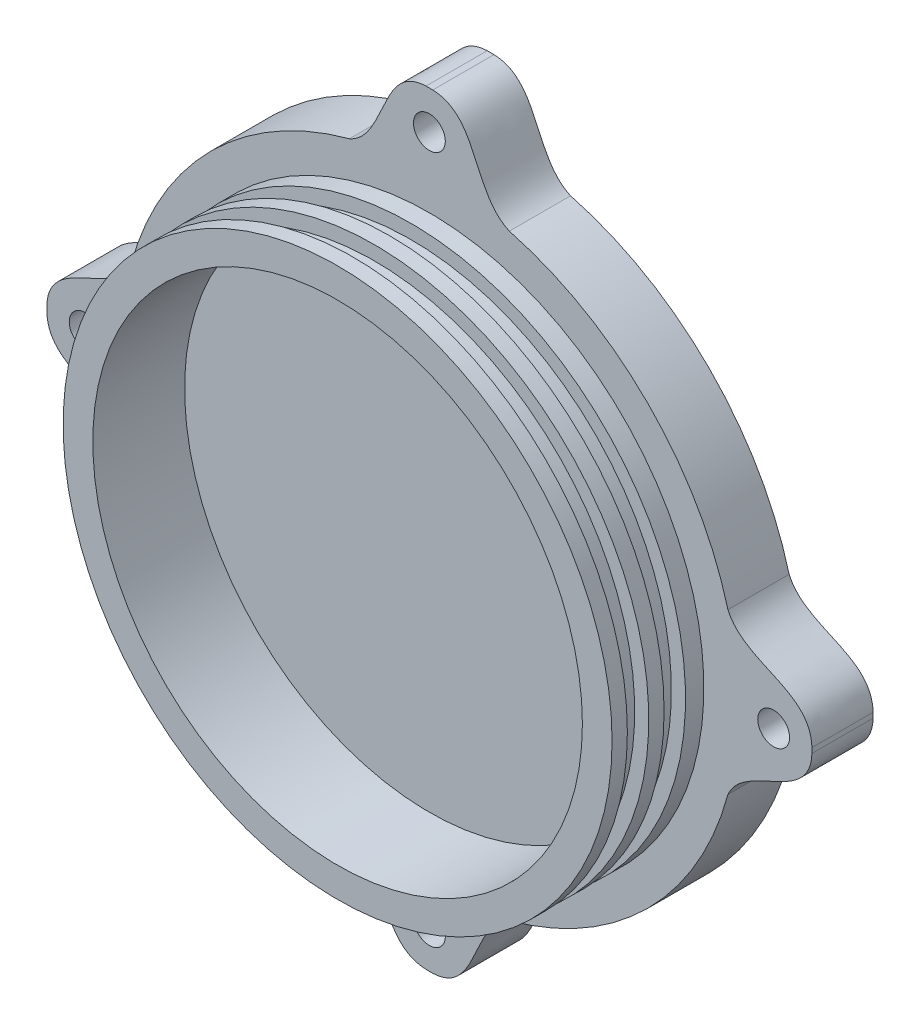
ISO-10303-21;
HEADER;
FILE_DESCRIPTION(('STEP AP214'),'2;1');
FILE_NAME('part.step','',(''),(''),'','','');
FILE_SCHEMA(('AUTOMOTIVE_DESIGN { 1 0 10303 214 1 1 1 1 }'));
ENDSEC;
DATA;
#1=APPLICATION_CONTEXT('core data for automotive mechanical design processes');
#2=APPLICATION_PROTOCOL_DEFINITION('international standard','automotive_design',2000,#1);
#3=PRODUCT_CONTEXT('',#1,'mechanical');
#4=PRODUCT('Part','Part','',(#3));
#5=PRODUCT_RELATED_PRODUCT_CATEGORY('part','',(#4));
#6=PRODUCT_DEFINITION_FORMATION('','',#4);
#7=PRODUCT_DEFINITION_CONTEXT('part definition',#1,'design');
#8=PRODUCT_DEFINITION('design','',#6,#7);
#9=PRODUCT_DEFINITION_SHAPE('','',#8);
#10=(LENGTH_UNIT() NAMED_UNIT(*) SI_UNIT(.MILLI.,.METRE.));
#11=(NAMED_UNIT(*) PLANE_ANGLE_UNIT() SI_UNIT($,.RADIAN.));
#12=(NAMED_UNIT(*) SI_UNIT($,.STERADIAN.) SOLID_ANGLE_UNIT());
#13=UNCERTAINTY_MEASURE_WITH_UNIT(LENGTH_MEASURE(1.E-05),#10,'distance_accuracy_value','');
#14=(GEOMETRIC_REPRESENTATION_CONTEXT(3) GLOBAL_UNCERTAINTY_ASSIGNED_CONTEXT((#13)) GLOBAL_UNIT_ASSIGNED_CONTEXT((#10,
#11,#12)) REPRESENTATION_CONTEXT('',''));
#15=CARTESIAN_POINT('',(0.,0.,0.));
#16=DIRECTION('',(0.,0.,1.));
#17=DIRECTION('',(1.,0.,0.));
#18=AXIS2_PLACEMENT_3D('',#15,#16,#17);
#19=CARTESIAN_POINT('',(0.,0.,-10.));
#20=DIRECTION('',(0.,0.,-1.));
#21=DIRECTION('',(-1.,0.,0.));
#22=AXIS2_PLACEMENT_3D('',#19,#20,#21);
#23=PLANE('',#22);
#24=CARTESIAN_POINT('',(56.25,0.,-10.));
#25=DIRECTION('',(0.,0.,-1.));
#26=DIRECTION('',(1.,0.,0.));
#27=AXIS2_PLACEMENT_3D('',#24,#25,#26);
#28=CIRCLE('',#27,2.59999999999999);
#29=CARTESIAN_POINT('',(58.85,0.,-10.));
#30=VERTEX_POINT('',#29);
#31=EDGE_CURVE('E219',#30,#30,#28,.T.);
#32=ORIENTED_EDGE('',*,*,#31,.F.);
#33=EDGE_LOOP('',(#32));
#34=FACE_BOUND('',#33,.T.);
#35=CARTESIAN_POINT('',(-5.89187475929779E-13,56.25,-10.));
#36=DIRECTION('',(0.,0.,-1.));
#37=DIRECTION('',(0.,1.,0.));
#38=AXIS2_PLACEMENT_3D('',#35,#36,#37);
#39=CIRCLE('',#38,2.59999999999999);
#40=CARTESIAN_POINT('',(-6.16421030372755E-13,58.85,-10.));
#41=VERTEX_POINT('',#40);
#42=EDGE_CURVE('E224',#41,#41,#39,.T.);
#43=ORIENTED_EDGE('',*,*,#42,.F.);
#44=EDGE_LOOP('',(#43));
#45=FACE_BOUND('',#44,.T.);
#46=CARTESIAN_POINT('',(1.96395825309926E-13,-56.25,-10.));
#47=DIRECTION('',(0.,0.,-1.));
#48=DIRECTION('',(0.,-1.,0.));
#49=AXIS2_PLACEMENT_3D('',#46,#47,#48);
#50=CIRCLE('',#49,2.59999999999999);
#51=CARTESIAN_POINT('',(2.05473676790918E-13,-58.85,-10.));
#52=VERTEX_POINT('',#51);
#53=EDGE_CURVE('E216',#52,#52,#50,.T.);
#54=ORIENTED_EDGE('',*,*,#53,.F.);
#55=EDGE_LOOP('',(#54));
#56=FACE_BOUND('',#55,.T.);
#57=CARTESIAN_POINT('',(-56.25,0.,-10.));
#58=DIRECTION('',(0.,0.,-1.));
#59=DIRECTION('',(-1.,0.,0.));
#60=AXIS2_PLACEMENT_3D('',#57,#58,#59);
#61=CIRCLE('',#60,2.59999999999999);
#62=CARTESIAN_POINT('',(-58.85,0.,-10.));
#63=VERTEX_POINT('',#62);
#64=EDGE_CURVE('E213',#63,#63,#61,.T.);
#65=ORIENTED_EDGE('',*,*,#64,.F.);
#66=EDGE_LOOP('',(#65));
#67=FACE_BOUND('',#66,.T.);
#68=CARTESIAN_POINT('',(0.,0.,-10.));
#69=DIRECTION('',(0.,0.,1.));
#70=DIRECTION('',(1.,0.,0.));
#71=AXIS2_PLACEMENT_3D('',#68,#69,#70);
#72=CIRCLE('',#71,50.5);
#73=CARTESIAN_POINT('',(-13.0703617776768,48.7792542275981,-10.));
#74=VERTEX_POINT('',#73);
#75=CARTESIAN_POINT('',(-48.7792542275979,13.0703617776777,-10.));
#76=VERTEX_POINT('',#75);
#77=EDGE_CURVE('E165',#74,#76,#72,.T.);
#78=ORIENTED_EDGE('',*,*,#77,.F.);
#79=CARTESIAN_POINT('',(6.61591644936995E-13,62.5,-10.));
#80=CARTESIAN_POINT('',(-8.15542315916666,62.7288766127194,-10.));
#81=CARTESIAN_POINT('',(-6.88965837095306,51.4602334051738,-10.));
#82=CARTESIAN_POINT('',(-13.0703617776768,48.7792542275981,-10.));
#83=B_SPLINE_CURVE_WITH_KNOTS('',3,(#79,#80,#81,#82),.UNSPECIFIED.,.F.,.F.,(4,4),(0.,1.),.UNSPECIFIED.);
#84=CARTESIAN_POINT('',(-0.554611570234183,62.497539199605,-10.));
#85=VERTEX_POINT('',#84);
#86=EDGE_CURVE('E156',#85,#74,#83,.T.);
#87=ORIENTED_EDGE('',*,*,#86,.F.);
#88=CARTESIAN_POINT('',(0.,0.,-10.));
#89=DIRECTION('',(0.,0.,-1.));
#90=DIRECTION('',(-1.,0.,0.));
#91=AXIS2_PLACEMENT_3D('',#88,#89,#90);
#92=CIRCLE('',#91,62.5);
#93=CARTESIAN_POINT('',(0.554611570234928,62.497539199605,-10.));
#94=VERTEX_POINT('',#93);
#95=EDGE_CURVE('E171',#85,#94,#92,.T.);
#96=ORIENTED_EDGE('',*,*,#95,.T.);
#97=CARTESIAN_POINT('',(6.61591644936995E-13,62.5,-10.));
#98=CARTESIAN_POINT('',(8.15542315916798,62.7288766127192,-10.));
#99=CARTESIAN_POINT('',(6.88965837095417,51.4602334051737,-10.));
#100=CARTESIAN_POINT('',(13.0703617776779,48.7792542275978,-10.));
#101=B_SPLINE_CURVE_WITH_KNOTS('',3,(#97,#98,#99,#100),.UNSPECIFIED.,.F.,.F.,(4,4),(0.,1.),.UNSPECIFIED.);
#102=CARTESIAN_POINT('',(13.0703617776779,48.7792542275978,-10.));
#103=VERTEX_POINT('',#102);
#104=EDGE_CURVE('E331',#94,#103,#101,.T.);
#105=ORIENTED_EDGE('',*,*,#104,.T.);
#106=CARTESIAN_POINT('',(0.,0.,-10.));
#107=DIRECTION('',(0.,0.,1.));
#108=DIRECTION('',(1.,0.,0.));
#109=AXIS2_PLACEMENT_3D('',#106,#107,#108);
#110=CIRCLE('',#109,50.5);
#111=CARTESIAN_POINT('',(48.7792542275979,13.0703617776773,-10.));
#112=VERTEX_POINT('',#111);
#113=EDGE_CURVE('E703',#112,#103,#110,.T.);
#114=ORIENTED_EDGE('',*,*,#113,.F.);
#115=CARTESIAN_POINT('',(62.5,0.,-10.));
#116=CARTESIAN_POINT('',(62.6669349784348,8.19455991647471,-10.));
#117=CARTESIAN_POINT('',(51.500002097116,6.86176806388334,-10.));
#118=CARTESIAN_POINT('',(48.7792542275979,13.0703617776773,-10.));
#119=B_SPLINE_CURVE_WITH_KNOTS('',3,(#115,#116,#117,#118),.UNSPECIFIED.,.F.,.F.,(4,4),(0.,1.),.UNSPECIFIED.);
#120=CARTESIAN_POINT('',(62.498616294225,0.415886171003084,-10.));
#121=VERTEX_POINT('',#120);
#122=EDGE_CURVE('E319',#121,#112,#119,.T.);
#123=ORIENTED_EDGE('',*,*,#122,.F.);
#124=CARTESIAN_POINT('',(62.498616294225,-0.415886171003084,-10.));
#125=VERTEX_POINT('',#124);
#126=EDGE_CURVE('E178',#121,#125,#92,.T.);
#127=ORIENTED_EDGE('',*,*,#126,.T.);
#128=CARTESIAN_POINT('',(62.5,0.,-10.));
#129=CARTESIAN_POINT('',(62.6669349784348,-8.19455991647471,-10.));
#130=CARTESIAN_POINT('',(51.500002097116,-6.86176806388334,-10.));
#131=CARTESIAN_POINT('',(48.7792542275979,-13.0703617776773,-10.));
#132=B_SPLINE_CURVE_WITH_KNOTS('',3,(#128,#129,#130,#131),.UNSPECIFIED.,.F.,.F.,(4,4),(0.,1.),.UNSPECIFIED.);
#133=CARTESIAN_POINT('',(48.7792542275979,-13.0703617776773,-10.));
#134=VERTEX_POINT('',#133);
#135=EDGE_CURVE('E689',#125,#134,#132,.T.);
#136=ORIENTED_EDGE('',*,*,#135,.T.);
#137=CARTESIAN_POINT('',(0.,0.,-10.));
#138=DIRECTION('',(0.,0.,1.));
#139=DIRECTION('',(1.,0.,0.));
#140=AXIS2_PLACEMENT_3D('',#137,#138,#139);
#141=CIRCLE('',#140,50.5);
#142=CARTESIAN_POINT('',(13.0703617776772,-48.779254227598,-10.));
#143=VERTEX_POINT('',#142);
#144=EDGE_CURVE('E715',#143,#134,#141,.T.);
#145=ORIENTED_EDGE('',*,*,#144,.F.);
#146=CARTESIAN_POINT('',(-2.18217583677696E-13,-62.5,-10.));
#147=CARTESIAN_POINT('',(8.1554231591671,-62.7288766127193,-10.));
#148=CARTESIAN_POINT('',(6.88965837095344,-51.4602334051738,-10.));
#149=CARTESIAN_POINT('',(13.0703617776772,-48.779254227598,-10.));
#150=B_SPLINE_CURVE_WITH_KNOTS('',3,(#146,#147,#148,#149),.UNSPECIFIED.,.F.,.F.,(4,4),(0.,1.),.UNSPECIFIED.);
#151=CARTESIAN_POINT('',(0.554611570234533,-62.497539199605,-10.));
#152=VERTEX_POINT('',#151);
#153=EDGE_CURVE('E684',#152,#143,#150,.T.);
#154=ORIENTED_EDGE('',*,*,#153,.F.);
#155=CARTESIAN_POINT('',(-0.554611570234214,-62.497539199605,-10.));
#156=VERTEX_POINT('',#155);
#157=EDGE_CURVE('E181',#152,#156,#92,.T.);
#158=ORIENTED_EDGE('',*,*,#157,.T.);
#159=CARTESIAN_POINT('',(-2.18217583677696E-13,-62.5,-10.));
#160=CARTESIAN_POINT('',(-8.15542315916755,-62.7288766127193,-10.));
#161=CARTESIAN_POINT('',(-6.88965837095378,-51.4602334051738,-10.));
#162=CARTESIAN_POINT('',(-13.0703617776775,-48.7792542275979,-10.));
#163=B_SPLINE_CURVE_WITH_KNOTS('',3,(#159,#160,#161,#162),.UNSPECIFIED.,.F.,.F.,(4,4),(0.,1.),.UNSPECIFIED.);
#164=CARTESIAN_POINT('',(-13.0703617776775,-48.7792542275979,-10.));
#165=VERTEX_POINT('',#164);
#166=EDGE_CURVE('E347',#156,#165,#163,.T.);
#167=ORIENTED_EDGE('',*,*,#166,.T.);
#168=CARTESIAN_POINT('',(0.,0.,-10.));
#169=DIRECTION('',(0.,0.,1.));
#170=DIRECTION('',(1.,0.,0.));
#171=AXIS2_PLACEMENT_3D('',#168,#169,#170);
#172=CIRCLE('',#171,50.5);
#173=CARTESIAN_POINT('',(-48.779254227598,-13.070361777677,-10.));
#174=VERTEX_POINT('',#173);
#175=EDGE_CURVE('E751',#174,#165,#172,.T.);
#176=ORIENTED_EDGE('',*,*,#175,.F.);
#177=CARTESIAN_POINT('',(-62.5,4.36435167355392E-13,-10.));
#178=CARTESIAN_POINT('',(-62.7288766127194,-8.15542315916689,-10.));
#179=CARTESIAN_POINT('',(-51.4602334051738,-6.88965837095326,-10.));
#180=CARTESIAN_POINT('',(-48.7792542275981,-13.070361777677,-10.));
#181=B_SPLINE_CURVE_WITH_KNOTS('',3,(#177,#178,#179,#180),.UNSPECIFIED.,.F.,.F.,(4,4),(0.,1.),.UNSPECIFIED.);
#182=CARTESIAN_POINT('',(-62.497539199605,-0.554611570234733,-10.));
#183=VERTEX_POINT('',#182);
#184=EDGE_CURVE('E342',#183,#174,#181,.T.);
#185=ORIENTED_EDGE('',*,*,#184,.F.);
#186=CARTESIAN_POINT('',(-62.497539199605,0.554611570235614,-10.));
#187=VERTEX_POINT('',#186);
#188=EDGE_CURVE('E177',#183,#187,#92,.T.);
#189=ORIENTED_EDGE('',*,*,#188,.T.);
#190=CARTESIAN_POINT('',(-62.5,4.36435167355392E-13,-10.));
#191=CARTESIAN_POINT('',(-62.7288766127193,8.15542315916776,-10.));
#192=CARTESIAN_POINT('',(-51.4602334051738,6.88965837095398,-10.));
#193=CARTESIAN_POINT('',(-48.7792542275979,13.0703617776777,-10.));
#194=B_SPLINE_CURVE_WITH_KNOTS('',3,(#190,#191,#192,#193),.UNSPECIFIED.,.F.,.F.,(4,4),(0.,1.),.UNSPECIFIED.);
#195=EDGE_CURVE('E173',#187,#76,#194,.T.);
#196=ORIENTED_EDGE('',*,*,#195,.T.);
#197=EDGE_LOOP('',(#78,#87,#96,#105,#114,#123,#127,#136,#145,#154,#158,#167,#176,#185,#189,#196));
#198=FACE_BOUND('',#197,.T.);
#199=ADVANCED_FACE('F36',(#34,#45,#56,#67,#198),#23,.T.);
#200=CARTESIAN_POINT('',(0.,0.,-10.));
#201=DIRECTION('',(0.,0.,1.));
#202=DIRECTION('',(1.,0.,0.));
#203=AXIS2_PLACEMENT_3D('',#200,#201,#202);
#204=CYLINDRICAL_SURFACE('',#203,62.5);
#205=DIRECTION('',(0.,0.,1.));
#206=VECTOR('',#205,1.);
#207=CARTESIAN_POINT('',(-0.554611570234183,62.497539199605,-10.));
#208=LINE('',#207,#206);
#209=CARTESIAN_POINT('',(-0.554611570234183,62.497539199605,0.));
#210=VERTEX_POINT('',#209);
#211=EDGE_CURVE('E152',#85,#210,#208,.T.);
#212=ORIENTED_EDGE('',*,*,#211,.T.);
#213=CARTESIAN_POINT('',(0.,0.,0.));
#214=DIRECTION('',(0.,0.,-1.));
#215=DIRECTION('',(-1.,0.,0.));
#216=AXIS2_PLACEMENT_3D('',#213,#214,#215);
#217=CIRCLE('',#216,62.5);
#218=CARTESIAN_POINT('',(0.554611570234928,62.497539199605,0.));
#219=VERTEX_POINT('',#218);
#220=EDGE_CURVE('E190',#210,#219,#217,.T.);
#221=ORIENTED_EDGE('',*,*,#220,.T.);
#222=DIRECTION('',(0.,0.,1.));
#223=VECTOR('',#222,1.);
#224=CARTESIAN_POINT('',(0.554611570234928,62.497539199605,-10.));
#225=LINE('',#224,#223);
#226=EDGE_CURVE('E61',#94,#219,#225,.T.);
#227=ORIENTED_EDGE('',*,*,#226,.F.);
#228=ORIENTED_EDGE('',*,*,#95,.F.);
#229=EDGE_LOOP('',(#212,#221,#227,#228));
#230=FACE_BOUND('',#229,.T.);
#231=ADVANCED_FACE('F176',(#230),#204,.T.);
#232=DIRECTION('',(0.,0.,1.));
#233=VECTOR('',#232,1.);
#234=CARTESIAN_POINT('',(0.554611570234533,-62.497539199605,-10.));
#235=LINE('',#234,#233);
#236=CARTESIAN_POINT('',(0.554611570234533,-62.497539199605,0.));
#237=VERTEX_POINT('',#236);
#238=EDGE_CURVE('E704',#152,#237,#235,.T.);
#239=ORIENTED_EDGE('',*,*,#238,.T.);
#240=CARTESIAN_POINT('',(-0.554611570234214,-62.497539199605,0.));
#241=VERTEX_POINT('',#240);
#242=EDGE_CURVE('E191',#237,#241,#217,.T.);
#243=ORIENTED_EDGE('',*,*,#242,.T.);
#244=DIRECTION('',(0.,0.,1.));
#245=VECTOR('',#244,1.);
#246=CARTESIAN_POINT('',(-0.554611570234214,-62.497539199605,-10.));
#247=LINE('',#246,#245);
#248=EDGE_CURVE('E744',#156,#241,#247,.T.);
#249=ORIENTED_EDGE('',*,*,#248,.F.);
#250=ORIENTED_EDGE('',*,*,#157,.F.);
#251=EDGE_LOOP('',(#239,#243,#249,#250));
#252=FACE_BOUND('',#251,.T.);
#253=ADVANCED_FACE('F280',(#252),#204,.T.);
#254=CARTESIAN_POINT('',(62.498616294225,0.415886171003084,0.));
#255=VERTEX_POINT('',#254);
#256=CARTESIAN_POINT('',(62.498616294225,-0.415886171003084,0.));
#257=VERTEX_POINT('',#256);
#258=EDGE_CURVE('E250',#255,#257,#217,.T.);
#259=ORIENTED_EDGE('',*,*,#258,.T.);
#260=DIRECTION('',(0.,0.,1.));
#261=VECTOR('',#260,1.);
#262=CARTESIAN_POINT('',(62.498616294225,-0.415886171003084,-10.));
#263=LINE('',#262,#261);
#264=EDGE_CURVE('E53',#125,#257,#263,.T.);
#265=ORIENTED_EDGE('',*,*,#264,.F.);
#266=ORIENTED_EDGE('',*,*,#126,.F.);
#267=DIRECTION('',(0.,0.,1.));
#268=VECTOR('',#267,1.);
#269=CARTESIAN_POINT('',(62.498616294225,0.415886171003084,-10.));
#270=LINE('',#269,#268);
#271=EDGE_CURVE('E304',#121,#255,#270,.T.);
#272=ORIENTED_EDGE('',*,*,#271,.T.);
#273=EDGE_LOOP('',(#259,#265,#266,#272));
#274=FACE_BOUND('',#273,.T.);
#275=ADVANCED_FACE('F288',(#274),#204,.T.);
#276=CARTESIAN_POINT('',(0.,0.,0.));
#277=DIRECTION('',(0.,0.,-1.));
#278=DIRECTION('',(-1.,0.,0.));
#279=AXIS2_PLACEMENT_3D('',#276,#277,#278);
#280=PLANE('',#279);
#281=CARTESIAN_POINT('',(56.25,0.,0.));
#282=DIRECTION('',(0.,0.,-1.));
#283=DIRECTION('',(-1.,0.,0.));
#284=AXIS2_PLACEMENT_3D('',#281,#282,#283);
#285=CIRCLE('',#284,2.59999999999999);
#286=CARTESIAN_POINT('',(53.65,0.,0.));
#287=VERTEX_POINT('',#286);
#288=EDGE_CURVE('E40',#287,#287,#285,.T.);
#289=ORIENTED_EDGE('',*,*,#288,.T.);
#290=EDGE_LOOP('',(#289));
#291=FACE_BOUND('',#290,.T.);
#292=CARTESIAN_POINT('',(-5.89187475929779E-13,56.25,0.));
#293=DIRECTION('',(0.,0.,-1.));
#294=DIRECTION('',(-1.,0.,0.));
#295=AXIS2_PLACEMENT_3D('',#292,#293,#294);
#296=CIRCLE('',#295,2.59999999999999);
#297=CARTESIAN_POINT('',(-2.60000000000058,56.25,0.));
#298=VERTEX_POINT('',#297);
#299=EDGE_CURVE('E217',#298,#298,#296,.T.);
#300=ORIENTED_EDGE('',*,*,#299,.T.);
#301=EDGE_LOOP('',(#300));
#302=FACE_BOUND('',#301,.T.);
#303=CARTESIAN_POINT('',(1.96395825309926E-13,-56.25,0.));
#304=DIRECTION('',(0.,0.,-1.));
#305=DIRECTION('',(-1.,0.,0.));
#306=AXIS2_PLACEMENT_3D('',#303,#304,#305);
#307=CIRCLE('',#306,2.59999999999999);
#308=CARTESIAN_POINT('',(-2.59999999999979,-56.25,0.));
#309=VERTEX_POINT('',#308);
#310=EDGE_CURVE('E214',#309,#309,#307,.T.);
#311=ORIENTED_EDGE('',*,*,#310,.T.);
#312=EDGE_LOOP('',(#311));
#313=FACE_BOUND('',#312,.T.);
#314=CARTESIAN_POINT('',(-56.25,0.,0.));
#315=DIRECTION('',(0.,0.,-1.));
#316=DIRECTION('',(-1.,0.,0.));
#317=AXIS2_PLACEMENT_3D('',#314,#315,#316);
#318=CIRCLE('',#317,2.59999999999999);
#319=CARTESIAN_POINT('',(-58.85,0.,0.));
#320=VERTEX_POINT('',#319);
#321=EDGE_CURVE('E209',#320,#320,#318,.T.);
#322=ORIENTED_EDGE('',*,*,#321,.T.);
#323=EDGE_LOOP('',(#322));
#324=FACE_BOUND('',#323,.T.);
#325=CARTESIAN_POINT('',(0.,0.,0.));
#326=DIRECTION('',(0.,0.,-1.));
#327=DIRECTION('',(-1.,0.,0.));
#328=AXIS2_PLACEMENT_3D('',#325,#326,#327);
#329=CIRCLE('',#328,44.85);
#330=CARTESIAN_POINT('',(-44.85,0.,0.));
#331=VERTEX_POINT('',#330);
#332=EDGE_CURVE('E45',#331,#331,#329,.T.);
#333=ORIENTED_EDGE('',*,*,#332,.T.);
#334=EDGE_LOOP('',(#333));
#335=FACE_BOUND('',#334,.T.);
#336=CARTESIAN_POINT('',(6.61591644936995E-13,62.5,0.));
#337=CARTESIAN_POINT('',(-8.15542315916666,62.7288766127194,0.));
#338=CARTESIAN_POINT('',(-6.88965837095306,51.4602334051738,0.));
#339=CARTESIAN_POINT('',(-13.0703617776768,48.7792542275981,0.));
#340=B_SPLINE_CURVE_WITH_KNOTS('',3,(#336,#337,#338,#339),.UNSPECIFIED.,.F.,.F.,(4,4),(0.,1.),.UNSPECIFIED.);
#341=CARTESIAN_POINT('',(-13.0703617776768,48.7792542275981,0.));
#342=VERTEX_POINT('',#341);
#343=EDGE_CURVE('E159',#210,#342,#340,.T.);
#344=ORIENTED_EDGE('',*,*,#343,.T.);
#345=CARTESIAN_POINT('',(0.,0.,0.));
#346=DIRECTION('',(0.,0.,1.));
#347=DIRECTION('',(1.,0.,0.));
#348=AXIS2_PLACEMENT_3D('',#345,#346,#347);
#349=CIRCLE('',#348,50.5);
#350=CARTESIAN_POINT('',(-48.7792542275979,13.0703617776777,0.));
#351=VERTEX_POINT('',#350);
#352=EDGE_CURVE('E174',#342,#351,#349,.T.);
#353=ORIENTED_EDGE('',*,*,#352,.T.);
#354=CARTESIAN_POINT('',(-62.5,4.36435167355392E-13,0.));
#355=CARTESIAN_POINT('',(-62.7288766127193,8.15542315916776,0.));
#356=CARTESIAN_POINT('',(-51.4602334051738,6.88965837095398,0.));
#357=CARTESIAN_POINT('',(-48.7792542275979,13.0703617776777,0.));
#358=B_SPLINE_CURVE_WITH_KNOTS('',3,(#354,#355,#356,#357),.UNSPECIFIED.,.F.,.F.,(4,4),(0.,1.),.UNSPECIFIED.);
#359=CARTESIAN_POINT('',(-62.497539199605,0.554611570235614,0.));
#360=VERTEX_POINT('',#359);
#361=EDGE_CURVE('E666',#360,#351,#358,.T.);
#362=ORIENTED_EDGE('',*,*,#361,.F.);
#363=CARTESIAN_POINT('',(-62.497539199605,-0.554611570234733,0.));
#364=VERTEX_POINT('',#363);
#365=EDGE_CURVE('E187',#364,#360,#217,.T.);
#366=ORIENTED_EDGE('',*,*,#365,.F.);
#367=CARTESIAN_POINT('',(-62.5,4.36435167355392E-13,0.));
#368=CARTESIAN_POINT('',(-62.7288766127194,-8.15542315916689,0.));
#369=CARTESIAN_POINT('',(-51.4602334051738,-6.88965837095326,0.));
#370=CARTESIAN_POINT('',(-48.7792542275981,-13.070361777677,0.));
#371=B_SPLINE_CURVE_WITH_KNOTS('',3,(#367,#368,#369,#370),.UNSPECIFIED.,.F.,.F.,(4,4),(0.,1.),.UNSPECIFIED.);
#372=CARTESIAN_POINT('',(-48.779254227598,-13.070361777677,0.));
#373=VERTEX_POINT('',#372);
#374=EDGE_CURVE('E680',#364,#373,#371,.T.);
#375=ORIENTED_EDGE('',*,*,#374,.T.);
#376=CARTESIAN_POINT('',(0.,0.,0.));
#377=DIRECTION('',(0.,0.,1.));
#378=DIRECTION('',(1.,0.,0.));
#379=AXIS2_PLACEMENT_3D('',#376,#377,#378);
#380=CIRCLE('',#379,50.5);
#381=CARTESIAN_POINT('',(-13.0703617776775,-48.7792542275979,0.));
#382=VERTEX_POINT('',#381);
#383=EDGE_CURVE('E348',#373,#382,#380,.T.);
#384=ORIENTED_EDGE('',*,*,#383,.T.);
#385=CARTESIAN_POINT('',(-2.18217583677696E-13,-62.5,0.));
#386=CARTESIAN_POINT('',(-8.15542315916755,-62.7288766127193,0.));
#387=CARTESIAN_POINT('',(-6.88965837095378,-51.4602334051738,0.));
#388=CARTESIAN_POINT('',(-13.0703617776775,-48.7792542275979,0.));
#389=B_SPLINE_CURVE_WITH_KNOTS('',3,(#385,#386,#387,#388),.UNSPECIFIED.,.F.,.F.,(4,4),(0.,1.),.UNSPECIFIED.);
#390=EDGE_CURVE('E759',#241,#382,#389,.T.);
#391=ORIENTED_EDGE('',*,*,#390,.F.);
#392=ORIENTED_EDGE('',*,*,#242,.F.);
#393=CARTESIAN_POINT('',(-2.18217583677696E-13,-62.5,0.));
#394=CARTESIAN_POINT('',(8.1554231591671,-62.7288766127193,0.));
#395=CARTESIAN_POINT('',(6.88965837095344,-51.4602334051738,0.));
#396=CARTESIAN_POINT('',(13.0703617776772,-48.779254227598,0.));
#397=B_SPLINE_CURVE_WITH_KNOTS('',3,(#393,#394,#395,#396),.UNSPECIFIED.,.F.,.F.,(4,4),(0.,1.),.UNSPECIFIED.);
#398=CARTESIAN_POINT('',(13.0703617776772,-48.779254227598,0.));
#399=VERTEX_POINT('',#398);
#400=EDGE_CURVE('E336',#237,#399,#397,.T.);
#401=ORIENTED_EDGE('',*,*,#400,.T.);
#402=CARTESIAN_POINT('',(0.,0.,0.));
#403=DIRECTION('',(0.,0.,1.));
#404=DIRECTION('',(1.,0.,0.));
#405=AXIS2_PLACEMENT_3D('',#402,#403,#404);
#406=CIRCLE('',#405,50.5);
#407=CARTESIAN_POINT('',(48.7792542275979,-13.0703617776773,0.));
#408=VERTEX_POINT('',#407);
#409=EDGE_CURVE('E690',#399,#408,#406,.T.);
#410=ORIENTED_EDGE('',*,*,#409,.T.);
#411=CARTESIAN_POINT('',(62.5,0.,0.));
#412=CARTESIAN_POINT('',(62.6669349784348,-8.19455991647471,0.));
#413=CARTESIAN_POINT('',(51.500002097116,-6.86176806388334,0.));
#414=CARTESIAN_POINT('',(48.7792542275979,-13.0703617776773,0.));
#415=B_SPLINE_CURVE_WITH_KNOTS('',3,(#411,#412,#413,#414),.UNSPECIFIED.,.F.,.F.,(4,4),(0.,1.),.UNSPECIFIED.);
#416=EDGE_CURVE('E724',#257,#408,#415,.T.);
#417=ORIENTED_EDGE('',*,*,#416,.F.);
#418=ORIENTED_EDGE('',*,*,#258,.F.);
#419=CARTESIAN_POINT('',(62.5,0.,0.));
#420=CARTESIAN_POINT('',(62.6669349784348,8.19455991647471,0.));
#421=CARTESIAN_POINT('',(51.500002097116,6.86176806388334,0.));
#422=CARTESIAN_POINT('',(48.7792542275979,13.0703617776773,0.));
#423=B_SPLINE_CURVE_WITH_KNOTS('',3,(#419,#420,#421,#422),.UNSPECIFIED.,.F.,.F.,(4,4),(0.,1.),.UNSPECIFIED.);
#424=CARTESIAN_POINT('',(48.7792542275979,13.0703617776773,0.));
#425=VERTEX_POINT('',#424);
#426=EDGE_CURVE('E314',#255,#425,#423,.T.);
#427=ORIENTED_EDGE('',*,*,#426,.T.);
#428=CARTESIAN_POINT('',(0.,0.,0.));
#429=DIRECTION('',(0.,0.,1.));
#430=DIRECTION('',(1.,0.,0.));
#431=AXIS2_PLACEMENT_3D('',#428,#429,#430);
#432=CIRCLE('',#431,50.5);
#433=CARTESIAN_POINT('',(13.0703617776779,48.7792542275978,0.));
#434=VERTEX_POINT('',#433);
#435=EDGE_CURVE('E311',#425,#434,#432,.T.);
#436=ORIENTED_EDGE('',*,*,#435,.T.);
#437=CARTESIAN_POINT('',(6.61591644936995E-13,62.5,0.));
#438=CARTESIAN_POINT('',(8.15542315916798,62.7288766127192,0.));
#439=CARTESIAN_POINT('',(6.88965837095417,51.4602334051737,0.));
#440=CARTESIAN_POINT('',(13.0703617776779,48.7792542275978,0.));
#441=B_SPLINE_CURVE_WITH_KNOTS('',3,(#437,#438,#439,#440),.UNSPECIFIED.,.F.,.F.,(4,4),(0.,1.),.UNSPECIFIED.);
#442=EDGE_CURVE('E309',#219,#434,#441,.T.);
#443=ORIENTED_EDGE('',*,*,#442,.F.);
#444=ORIENTED_EDGE('',*,*,#220,.F.);
#445=EDGE_LOOP('',(#344,#353,#362,#366,#375,#384,#391,#392,#401,#410,#417,#418,#427,#436,#443,#444));
#446=FACE_BOUND('',#445,.T.);
#447=ADVANCED_FACE('F286',(#291,#302,#313,#324,#335,#446),#280,.F.);
#448=ORIENTED_EDGE('',*,*,#365,.T.);
#449=DIRECTION('',(0.,0.,1.));
#450=VECTOR('',#449,1.);
#451=CARTESIAN_POINT('',(-62.497539199605,0.554611570235614,-10.));
#452=LINE('',#451,#450);
#453=EDGE_CURVE('E164',#187,#360,#452,.T.);
#454=ORIENTED_EDGE('',*,*,#453,.F.);
#455=ORIENTED_EDGE('',*,*,#188,.F.);
#456=DIRECTION('',(0.,0.,1.));
#457=VECTOR('',#456,1.);
#458=CARTESIAN_POINT('',(-62.497539199605,-0.554611570234733,-10.));
#459=LINE('',#458,#457);
#460=EDGE_CURVE('E232',#183,#364,#459,.T.);
#461=ORIENTED_EDGE('',*,*,#460,.T.);
#462=EDGE_LOOP('',(#448,#454,#455,#461));
#463=FACE_BOUND('',#462,.T.);
#464=ADVANCED_FACE('F268',(#463),#204,.T.);
#465=CARTESIAN_POINT('',(0.,0.,15.));
#466=DIRECTION('',(0.,0.,-1.));
#467=DIRECTION('',(-1.,0.,0.));
#468=AXIS2_PLACEMENT_3D('',#465,#466,#467);
#469=CYLINDRICAL_SURFACE('',#468,44.85);
#470=CARTESIAN_POINT('',(0.,0.,6.50000000000001));
#471=DIRECTION('',(0.,0.,1.));
#472=DIRECTION('',(1.,0.,0.));
#473=AXIS2_PLACEMENT_3D('',#470,#471,#472);
#474=CIRCLE('',#473,44.85);
#475=CARTESIAN_POINT('',(44.85,0.,6.50000000000001));
#476=VERTEX_POINT('',#475);
#477=EDGE_CURVE('E204',#476,#476,#474,.T.);
#478=ORIENTED_EDGE('',*,*,#477,.T.);
#479=EDGE_LOOP('',(#478));
#480=FACE_BOUND('',#479,.T.);
#481=CARTESIAN_POINT('',(0.,0.,9.00000000000001));
#482=DIRECTION('',(0.,0.,-1.));
#483=DIRECTION('',(-1.,0.,0.));
#484=AXIS2_PLACEMENT_3D('',#481,#482,#483);
#485=CIRCLE('',#484,44.85);
#486=CARTESIAN_POINT('',(-44.85,0.,9.00000000000001));
#487=VERTEX_POINT('',#486);
#488=EDGE_CURVE('E194',#487,#487,#485,.T.);
#489=ORIENTED_EDGE('',*,*,#488,.T.);
#490=EDGE_LOOP('',(#489));
#491=FACE_BOUND('',#490,.T.);
#492=ADVANCED_FACE('F263',(#480,#491),#469,.T.);
#493=CARTESIAN_POINT('',(0.,0.,12.5));
#494=DIRECTION('',(0.,0.,1.));
#495=DIRECTION('',(1.,0.,0.));
#496=AXIS2_PLACEMENT_3D('',#493,#494,#495);
#497=CIRCLE('',#496,44.85);
#498=CARTESIAN_POINT('',(44.85,0.,12.5));
#499=VERTEX_POINT('',#498);
#500=EDGE_CURVE('E197',#499,#499,#497,.T.);
#501=ORIENTED_EDGE('',*,*,#500,.T.);
#502=EDGE_LOOP('',(#501));
#503=FACE_BOUND('',#502,.T.);
#504=CARTESIAN_POINT('',(0.,0.,15.));
#505=DIRECTION('',(0.,0.,1.));
#506=DIRECTION('',(1.,0.,0.));
#507=AXIS2_PLACEMENT_3D('',#504,#505,#506);
#508=CIRCLE('',#507,44.85);
#509=CARTESIAN_POINT('',(44.85,0.,15.));
#510=VERTEX_POINT('',#509);
#511=EDGE_CURVE('E11',#510,#510,#508,.T.);
#512=ORIENTED_EDGE('',*,*,#511,.F.);
#513=EDGE_LOOP('',(#512));
#514=FACE_BOUND('',#513,.T.);
#515=ADVANCED_FACE('F259',(#503,#514),#469,.T.);
#516=CARTESIAN_POINT('',(0.,0.,15.));
#517=DIRECTION('',(0.,0.,1.));
#518=DIRECTION('',(1.,0.,0.));
#519=AXIS2_PLACEMENT_3D('',#516,#517,#518);
#520=PLANE('',#519);
#521=CARTESIAN_POINT('',(0.,0.,15.));
#522=DIRECTION('',(0.,0.,1.));
#523=DIRECTION('',(1.,0.,0.));
#524=AXIS2_PLACEMENT_3D('',#521,#522,#523);
#525=CIRCLE('',#524,40.);
#526=CARTESIAN_POINT('',(40.,0.,15.));
#527=VERTEX_POINT('',#526);
#528=EDGE_CURVE('E185',#527,#527,#525,.T.);
#529=ORIENTED_EDGE('',*,*,#528,.F.);
#530=EDGE_LOOP('',(#529));
#531=FACE_BOUND('',#530,.T.);
#532=ORIENTED_EDGE('',*,*,#511,.T.);
#533=EDGE_LOOP('',(#532));
#534=FACE_BOUND('',#533,.T.);
#535=ADVANCED_FACE('F256',(#531,#534),#520,.T.);
#536=CARTESIAN_POINT('',(0.,0.,0.));
#537=DIRECTION('',(0.,0.,1.));
#538=DIRECTION('',(1.,0.,0.));
#539=AXIS2_PLACEMENT_3D('',#536,#537,#538);
#540=CYLINDRICAL_SURFACE('',#539,40.);
#541=CARTESIAN_POINT('',(0.,0.,0.));
#542=DIRECTION('',(0.,0.,1.));
#543=DIRECTION('',(1.,0.,0.));
#544=AXIS2_PLACEMENT_3D('',#541,#542,#543);
#545=CIRCLE('',#544,40.);
#546=CARTESIAN_POINT('',(40.,0.,0.));
#547=VERTEX_POINT('',#546);
#548=EDGE_CURVE('E246',#547,#547,#545,.T.);
#549=ORIENTED_EDGE('',*,*,#548,.F.);
#550=EDGE_LOOP('',(#549));
#551=FACE_BOUND('',#550,.T.);
#552=ORIENTED_EDGE('',*,*,#528,.T.);
#553=EDGE_LOOP('',(#552));
#554=FACE_BOUND('',#553,.T.);
#555=ADVANCED_FACE('F254',(#551,#554),#540,.F.);
#556=CARTESIAN_POINT('',(0.,0.,0.));
#557=DIRECTION('',(0.,0.,1.));
#558=DIRECTION('',(1.,0.,0.));
#559=AXIS2_PLACEMENT_3D('',#556,#557,#558);
#560=PLANE('',#559);
#561=ORIENTED_EDGE('',*,*,#548,.T.);
#562=EDGE_LOOP('',(#561));
#563=FACE_BOUND('',#562,.T.);
#564=ADVANCED_FACE('F400',(#563),#560,.T.);
#565=CARTESIAN_POINT('',(0.,46.05,12.5));
#566=DIRECTION('',(0.,0.,1.));
#567=DIRECTION('',(1.,0.,0.));
#568=AXIS2_PLACEMENT_3D('',#565,#566,#567);
#569=PLANE('',#568);
#570=CARTESIAN_POINT('',(0.,0.,12.5));
#571=DIRECTION('',(0.,0.,-1.));
#572=DIRECTION('',(-1.,0.,0.));
#573=AXIS2_PLACEMENT_3D('',#570,#571,#572);
#574=CIRCLE('',#573,42.55);
#575=CARTESIAN_POINT('',(-42.55,0.,12.5));
#576=VERTEX_POINT('',#575);
#577=EDGE_CURVE('E198',#576,#576,#574,.T.);
#578=ORIENTED_EDGE('',*,*,#577,.F.);
#579=EDGE_LOOP('',(#578));
#580=FACE_BOUND('',#579,.T.);
#581=ORIENTED_EDGE('',*,*,#500,.F.);
#582=EDGE_LOOP('',(#581));
#583=FACE_BOUND('',#582,.T.);
#584=ADVANCED_FACE('F394',(#580,#583),#569,.F.);
#585=CARTESIAN_POINT('',(0.,46.05,9.00000000000001));
#586=DIRECTION('',(0.,0.,-1.));
#587=DIRECTION('',(-1.,0.,0.));
#588=AXIS2_PLACEMENT_3D('',#585,#586,#587);
#589=PLANE('',#588);
#590=CARTESIAN_POINT('',(0.,0.,9.00000000000001));
#591=DIRECTION('',(0.,0.,-1.));
#592=DIRECTION('',(-1.,0.,0.));
#593=AXIS2_PLACEMENT_3D('',#590,#591,#592);
#594=CIRCLE('',#593,42.55);
#595=CARTESIAN_POINT('',(-42.55,0.,9.00000000000001));
#596=VERTEX_POINT('',#595);
#597=EDGE_CURVE('E208',#596,#596,#594,.T.);
#598=ORIENTED_EDGE('',*,*,#597,.T.);
#599=EDGE_LOOP('',(#598));
#600=FACE_BOUND('',#599,.T.);
#601=ORIENTED_EDGE('',*,*,#488,.F.);
#602=EDGE_LOOP('',(#601));
#603=FACE_BOUND('',#602,.T.);
#604=ADVANCED_FACE('F391',(#600,#603),#589,.F.);
#605=CARTESIAN_POINT('',(0.,0.,-42.713110189006));
#606=DIRECTION('',(0.,0.,-1.));
#607=DIRECTION('',(-1.,0.,0.));
#608=AXIS2_PLACEMENT_3D('',#605,#606,#607);
#609=CYLINDRICAL_SURFACE('',#608,42.55);
#610=ORIENTED_EDGE('',*,*,#597,.F.);
#611=EDGE_LOOP('',(#610));
#612=FACE_BOUND('',#611,.T.);
#613=ORIENTED_EDGE('',*,*,#577,.T.);
#614=EDGE_LOOP('',(#613));
#615=FACE_BOUND('',#614,.T.);
#616=ADVANCED_FACE('F389',(#612,#615),#609,.T.);
#617=CARTESIAN_POINT('',(0.,46.05,6.50000000000001));
#618=DIRECTION('',(0.,0.,1.));
#619=DIRECTION('',(1.,0.,0.));
#620=AXIS2_PLACEMENT_3D('',#617,#618,#619);
#621=PLANE('',#620);
#622=CARTESIAN_POINT('',(0.,0.,6.50000000000001));
#623=DIRECTION('',(0.,0.,-1.));
#624=DIRECTION('',(-1.,0.,0.));
#625=AXIS2_PLACEMENT_3D('',#622,#623,#624);
#626=CIRCLE('',#625,42.55);
#627=CARTESIAN_POINT('',(-42.55,0.,6.50000000000001));
#628=VERTEX_POINT('',#627);
#629=EDGE_CURVE('E205',#628,#628,#626,.T.);
#630=ORIENTED_EDGE('',*,*,#629,.F.);
#631=EDGE_LOOP('',(#630));
#632=FACE_BOUND('',#631,.T.);
#633=ORIENTED_EDGE('',*,*,#477,.F.);
#634=EDGE_LOOP('',(#633));
#635=FACE_BOUND('',#634,.T.);
#636=ADVANCED_FACE('F382',(#632,#635),#621,.F.);
#637=CARTESIAN_POINT('',(0.,46.05,3.00000000000001));
#638=DIRECTION('',(0.,0.,-1.));
#639=DIRECTION('',(-1.,0.,0.));
#640=AXIS2_PLACEMENT_3D('',#637,#638,#639);
#641=PLANE('',#640);
#642=CARTESIAN_POINT('',(0.,0.,3.00000000000001));
#643=DIRECTION('',(0.,0.,-1.));
#644=DIRECTION('',(-1.,0.,0.));
#645=AXIS2_PLACEMENT_3D('',#642,#643,#644);
#646=CIRCLE('',#645,42.55);
#647=CARTESIAN_POINT('',(-42.55,0.,3.00000000000001));
#648=VERTEX_POINT('',#647);
#649=EDGE_CURVE('E212',#648,#648,#646,.T.);
#650=ORIENTED_EDGE('',*,*,#649,.T.);
#651=EDGE_LOOP('',(#650));
#652=FACE_BOUND('',#651,.T.);
#653=CARTESIAN_POINT('',(0.,0.,3.00000000000001));
#654=DIRECTION('',(0.,0.,-1.));
#655=DIRECTION('',(-1.,0.,0.));
#656=AXIS2_PLACEMENT_3D('',#653,#654,#655);
#657=CIRCLE('',#656,44.85);
#658=CARTESIAN_POINT('',(-44.85,0.,3.00000000000001));
#659=VERTEX_POINT('',#658);
#660=EDGE_CURVE('E201',#659,#659,#657,.T.);
#661=ORIENTED_EDGE('',*,*,#660,.F.);
#662=EDGE_LOOP('',(#661));
#663=FACE_BOUND('',#662,.T.);
#664=ADVANCED_FACE('F379',(#652,#663),#641,.F.);
#665=CARTESIAN_POINT('',(0.,0.,-42.713110189006));
#666=DIRECTION('',(0.,0.,-1.));
#667=DIRECTION('',(-1.,0.,0.));
#668=AXIS2_PLACEMENT_3D('',#665,#666,#667);
#669=CYLINDRICAL_SURFACE('',#668,42.55);
#670=ORIENTED_EDGE('',*,*,#649,.F.);
#671=EDGE_LOOP('',(#670));
#672=FACE_BOUND('',#671,.T.);
#673=ORIENTED_EDGE('',*,*,#629,.T.);
#674=EDGE_LOOP('',(#673));
#675=FACE_BOUND('',#674,.T.);
#676=ADVANCED_FACE('F272',(#672,#675),#669,.T.);
#677=ORIENTED_EDGE('',*,*,#660,.T.);
#678=EDGE_LOOP('',(#677));
#679=FACE_BOUND('',#678,.T.);
#680=ORIENTED_EDGE('',*,*,#332,.F.);
#681=EDGE_LOOP('',(#680));
#682=FACE_BOUND('',#681,.T.);
#683=ADVANCED_FACE('F38',(#679,#682),#469,.T.);
#684=CARTESIAN_POINT('',(-56.25,0.,15.));
#685=DIRECTION('',(0.,0.,-1.));
#686=DIRECTION('',(-1.,0.,0.));
#687=AXIS2_PLACEMENT_3D('',#684,#685,#686);
#688=CYLINDRICAL_SURFACE('',#687,2.59999999999999);
#689=ORIENTED_EDGE('',*,*,#64,.T.);
#690=EDGE_LOOP('',(#689));
#691=FACE_BOUND('',#690,.T.);
#692=ORIENTED_EDGE('',*,*,#321,.F.);
#693=EDGE_LOOP('',(#692));
#694=FACE_BOUND('',#693,.T.);
#695=ADVANCED_FACE('F271',(#691,#694),#688,.F.);
#696=CARTESIAN_POINT('',(1.96395825309926E-13,-56.25,15.));
#697=DIRECTION('',(0.,0.,-1.));
#698=DIRECTION('',(-1.,0.,0.));
#699=AXIS2_PLACEMENT_3D('',#696,#697,#698);
#700=CYLINDRICAL_SURFACE('',#699,2.59999999999999);
#701=ORIENTED_EDGE('',*,*,#53,.T.);
#702=EDGE_LOOP('',(#701));
#703=FACE_BOUND('',#702,.T.);
#704=ORIENTED_EDGE('',*,*,#310,.F.);
#705=EDGE_LOOP('',(#704));
#706=FACE_BOUND('',#705,.T.);
#707=ADVANCED_FACE('F371',(#703,#706),#700,.F.);
#708=CARTESIAN_POINT('',(-5.89187475929779E-13,56.25,15.));
#709=DIRECTION('',(0.,0.,-1.));
#710=DIRECTION('',(-1.,0.,0.));
#711=AXIS2_PLACEMENT_3D('',#708,#709,#710);
#712=CYLINDRICAL_SURFACE('',#711,2.59999999999999);
#713=ORIENTED_EDGE('',*,*,#42,.T.);
#714=EDGE_LOOP('',(#713));
#715=FACE_BOUND('',#714,.T.);
#716=ORIENTED_EDGE('',*,*,#299,.F.);
#717=EDGE_LOOP('',(#716));
#718=FACE_BOUND('',#717,.T.);
#719=ADVANCED_FACE('F368',(#715,#718),#712,.F.);
#720=CARTESIAN_POINT('',(56.25,0.,15.));
#721=DIRECTION('',(0.,0.,-1.));
#722=DIRECTION('',(-1.,0.,0.));
#723=AXIS2_PLACEMENT_3D('',#720,#721,#722);
#724=CYLINDRICAL_SURFACE('',#723,2.59999999999999);
#725=ORIENTED_EDGE('',*,*,#31,.T.);
#726=EDGE_LOOP('',(#725));
#727=FACE_BOUND('',#726,.T.);
#728=ORIENTED_EDGE('',*,*,#288,.F.);
#729=EDGE_LOOP('',(#728));
#730=FACE_BOUND('',#729,.T.);
#731=ADVANCED_FACE('F362',(#727,#730),#724,.F.);
#732=DIRECTION('',(0.,0.,1.));
#733=VECTOR('',#732,1.);
#734=SURFACE_OF_LINEAR_EXTRUSION('',#181,#733);
#735=ORIENTED_EDGE('',*,*,#374,.F.);
#736=ORIENTED_EDGE('',*,*,#460,.F.);
#737=ORIENTED_EDGE('',*,*,#184,.T.);
#738=DIRECTION('',(0.,0.,1.));
#739=VECTOR('',#738,1.);
#740=CARTESIAN_POINT('',(-48.779254227598,-13.070361777677,-10.));
#741=LINE('',#740,#739);
#742=EDGE_CURVE('E229',#174,#373,#741,.T.);
#743=ORIENTED_EDGE('',*,*,#742,.T.);
#744=EDGE_LOOP('',(#735,#736,#737,#743));
#745=FACE_BOUND('',#744,.T.);
#746=ADVANCED_FACE('F357',(#745),#734,.T.);
#747=CARTESIAN_POINT('',(0.,0.,-10.));
#748=DIRECTION('',(0.,0.,1.));
#749=DIRECTION('',(1.,0.,0.));
#750=AXIS2_PLACEMENT_3D('',#747,#748,#749);
#751=CYLINDRICAL_SURFACE('',#750,50.5);
#752=ORIENTED_EDGE('',*,*,#383,.F.);
#753=ORIENTED_EDGE('',*,*,#742,.F.);
#754=ORIENTED_EDGE('',*,*,#175,.T.);
#755=DIRECTION('',(0.,0.,1.));
#756=VECTOR('',#755,1.);
#757=CARTESIAN_POINT('',(-13.0703617776775,-48.7792542275979,-10.));
#758=LINE('',#757,#756);
#759=EDGE_CURVE('E750',#165,#382,#758,.T.);
#760=ORIENTED_EDGE('',*,*,#759,.T.);
#761=EDGE_LOOP('',(#752,#753,#754,#760));
#762=FACE_BOUND('',#761,.T.);
#763=ADVANCED_FACE('F361',(#762),#751,.T.);
#764=DIRECTION('',(0.,0.,1.));
#765=VECTOR('',#764,1.);
#766=SURFACE_OF_LINEAR_EXTRUSION('',#163,#765);
#767=ORIENTED_EDGE('',*,*,#390,.T.);
#768=ORIENTED_EDGE('',*,*,#759,.F.);
#769=ORIENTED_EDGE('',*,*,#166,.F.);
#770=ORIENTED_EDGE('',*,*,#248,.T.);
#771=EDGE_LOOP('',(#767,#768,#769,#770));
#772=FACE_BOUND('',#771,.T.);
#773=ADVANCED_FACE('F364',(#772),#766,.F.);
#774=DIRECTION('',(0.,0.,1.));
#775=VECTOR('',#774,1.);
#776=SURFACE_OF_LINEAR_EXTRUSION('',#119,#775);
#777=ORIENTED_EDGE('',*,*,#426,.F.);
#778=ORIENTED_EDGE('',*,*,#271,.F.);
#779=ORIENTED_EDGE('',*,*,#122,.T.);
#780=DIRECTION('',(0.,0.,1.));
#781=VECTOR('',#780,1.);
#782=CARTESIAN_POINT('',(48.7792542275979,13.0703617776773,-10.));
#783=LINE('',#782,#781);
#784=EDGE_CURVE('E337',#112,#425,#783,.T.);
#785=ORIENTED_EDGE('',*,*,#784,.T.);
#786=EDGE_LOOP('',(#777,#778,#779,#785));
#787=FACE_BOUND('',#786,.T.);
#788=ADVANCED_FACE('F534',(#787),#776,.T.);
#789=CARTESIAN_POINT('',(0.,0.,-10.));
#790=DIRECTION('',(0.,0.,1.));
#791=DIRECTION('',(1.,0.,0.));
#792=AXIS2_PLACEMENT_3D('',#789,#790,#791);
#793=CYLINDRICAL_SURFACE('',#792,50.5);
#794=ORIENTED_EDGE('',*,*,#435,.F.);
#795=ORIENTED_EDGE('',*,*,#784,.F.);
#796=ORIENTED_EDGE('',*,*,#113,.T.);
#797=DIRECTION('',(0.,0.,1.));
#798=VECTOR('',#797,1.);
#799=CARTESIAN_POINT('',(13.0703617776779,48.7792542275978,-10.));
#800=LINE('',#799,#798);
#801=EDGE_CURVE('E339',#103,#434,#800,.T.);
#802=ORIENTED_EDGE('',*,*,#801,.T.);
#803=EDGE_LOOP('',(#794,#795,#796,#802));
#804=FACE_BOUND('',#803,.T.);
#805=ADVANCED_FACE('F542',(#804),#793,.T.);
#806=DIRECTION('',(0.,0.,1.));
#807=VECTOR('',#806,1.);
#808=SURFACE_OF_LINEAR_EXTRUSION('',#101,#807);
#809=ORIENTED_EDGE('',*,*,#442,.T.);
#810=ORIENTED_EDGE('',*,*,#801,.F.);
#811=ORIENTED_EDGE('',*,*,#104,.F.);
#812=ORIENTED_EDGE('',*,*,#226,.T.);
#813=EDGE_LOOP('',(#809,#810,#811,#812));
#814=FACE_BOUND('',#813,.T.);
#815=ADVANCED_FACE('F551',(#814),#808,.F.);
#816=DIRECTION('',(0.,0.,1.));
#817=VECTOR('',#816,1.);
#818=SURFACE_OF_LINEAR_EXTRUSION('',#150,#817);
#819=ORIENTED_EDGE('',*,*,#400,.F.);
#820=ORIENTED_EDGE('',*,*,#238,.F.);
#821=ORIENTED_EDGE('',*,*,#153,.T.);
#822=DIRECTION('',(0.,0.,1.));
#823=VECTOR('',#822,1.);
#824=CARTESIAN_POINT('',(13.0703617776772,-48.779254227598,-10.));
#825=LINE('',#824,#823);
#826=EDGE_CURVE('E667',#143,#399,#825,.T.);
#827=ORIENTED_EDGE('',*,*,#826,.T.);
#828=EDGE_LOOP('',(#819,#820,#821,#827));
#829=FACE_BOUND('',#828,.T.);
#830=ADVANCED_FACE('F560',(#829),#818,.T.);
#831=CARTESIAN_POINT('',(0.,0.,-10.));
#832=DIRECTION('',(0.,0.,1.));
#833=DIRECTION('',(1.,0.,0.));
#834=AXIS2_PLACEMENT_3D('',#831,#832,#833);
#835=CYLINDRICAL_SURFACE('',#834,50.5);
#836=ORIENTED_EDGE('',*,*,#409,.F.);
#837=ORIENTED_EDGE('',*,*,#826,.F.);
#838=ORIENTED_EDGE('',*,*,#144,.T.);
#839=DIRECTION('',(0.,0.,1.));
#840=VECTOR('',#839,1.);
#841=CARTESIAN_POINT('',(48.7792542275979,-13.0703617776773,-10.));
#842=LINE('',#841,#840);
#843=EDGE_CURVE('E738',#134,#408,#842,.T.);
#844=ORIENTED_EDGE('',*,*,#843,.T.);
#845=EDGE_LOOP('',(#836,#837,#838,#844));
#846=FACE_BOUND('',#845,.T.);
#847=ADVANCED_FACE('F568',(#846),#835,.T.);
#848=DIRECTION('',(0.,0.,1.));
#849=VECTOR('',#848,1.);
#850=SURFACE_OF_LINEAR_EXTRUSION('',#132,#849);
#851=ORIENTED_EDGE('',*,*,#416,.T.);
#852=ORIENTED_EDGE('',*,*,#843,.F.);
#853=ORIENTED_EDGE('',*,*,#135,.F.);
#854=ORIENTED_EDGE('',*,*,#264,.T.);
#855=EDGE_LOOP('',(#851,#852,#853,#854));
#856=FACE_BOUND('',#855,.T.);
#857=ADVANCED_FACE('F577',(#856),#850,.F.);
#858=DIRECTION('',(0.,0.,1.));
#859=VECTOR('',#858,1.);
#860=SURFACE_OF_LINEAR_EXTRUSION('',#83,#859);
#861=ORIENTED_EDGE('',*,*,#343,.F.);
#862=ORIENTED_EDGE('',*,*,#211,.F.);
#863=ORIENTED_EDGE('',*,*,#86,.T.);
#864=DIRECTION('',(0.,0.,1.));
#865=VECTOR('',#864,1.);
#866=CARTESIAN_POINT('',(-13.0703617776768,48.7792542275981,-10.));
#867=LINE('',#866,#865);
#868=EDGE_CURVE('E678',#74,#342,#867,.T.);
#869=ORIENTED_EDGE('',*,*,#868,.T.);
#870=EDGE_LOOP('',(#861,#862,#863,#869));
#871=FACE_BOUND('',#870,.T.);
#872=ADVANCED_FACE('F154',(#871),#860,.T.);
#873=CARTESIAN_POINT('',(0.,0.,-10.));
#874=DIRECTION('',(0.,0.,1.));
#875=DIRECTION('',(1.,0.,0.));
#876=AXIS2_PLACEMENT_3D('',#873,#874,#875);
#877=CYLINDRICAL_SURFACE('',#876,50.5);
#878=ORIENTED_EDGE('',*,*,#352,.F.);
#879=ORIENTED_EDGE('',*,*,#868,.F.);
#880=ORIENTED_EDGE('',*,*,#77,.T.);
#881=DIRECTION('',(0.,0.,1.));
#882=VECTOR('',#881,1.);
#883=CARTESIAN_POINT('',(-48.7792542275979,13.0703617776777,-10.));
#884=LINE('',#883,#882);
#885=EDGE_CURVE('E681',#76,#351,#884,.T.);
#886=ORIENTED_EDGE('',*,*,#885,.T.);
#887=EDGE_LOOP('',(#878,#879,#880,#886));
#888=FACE_BOUND('',#887,.T.);
#889=ADVANCED_FACE('F593',(#888),#877,.T.);
#890=DIRECTION('',(0.,0.,1.));
#891=VECTOR('',#890,1.);
#892=SURFACE_OF_LINEAR_EXTRUSION('',#194,#891);
#893=ORIENTED_EDGE('',*,*,#361,.T.);
#894=ORIENTED_EDGE('',*,*,#885,.F.);
#895=ORIENTED_EDGE('',*,*,#195,.F.);
#896=ORIENTED_EDGE('',*,*,#453,.T.);
#897=EDGE_LOOP('',(#893,#894,#895,#896));
#898=FACE_BOUND('',#897,.T.);
#899=ADVANCED_FACE('F601',(#898),#892,.F.);
#900=CLOSED_SHELL('',(#199,#231,#253,#275,#447,#464,#492,#515,#535,#555,#564,#584,#604,#616,
#636,#664,#676,#683,#695,#707,#719,#731,#746,#763,#773,#788,#805,#815,#830,#847,#857,#872,#889,#899));
#901=MANIFOLD_SOLID_BREP('B2',#900);
#902=ADVANCED_BREP_SHAPE_REPRESENTATION('',(#18,#901),#14);
#903=SHAPE_DEFINITION_REPRESENTATION(#9,#902);
ENDSEC;
END-ISO-10303-21;
